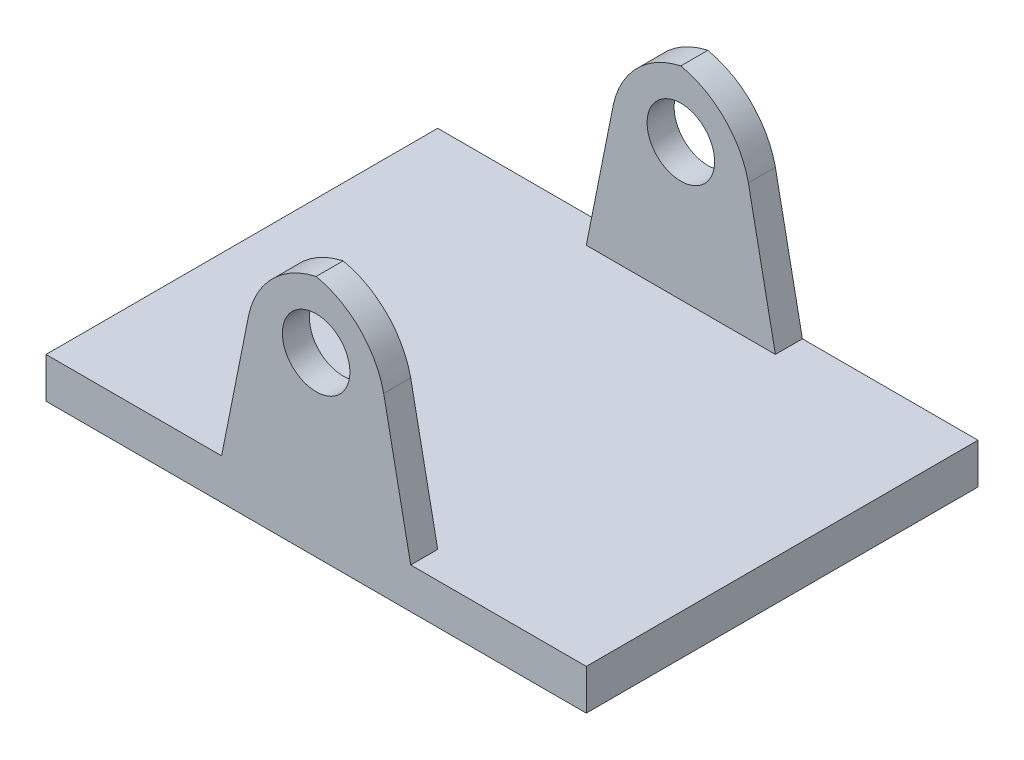
ISO-10303-21;
HEADER;
FILE_DESCRIPTION(('STEP AP214'),'2;1');
FILE_NAME('part.step','',(''),(''),'','','');
FILE_SCHEMA(('AUTOMOTIVE_DESIGN { 1 0 10303 214 1 1 1 1 }'));
ENDSEC;
DATA;
#1=APPLICATION_CONTEXT('core data for automotive mechanical design processes');
#2=APPLICATION_PROTOCOL_DEFINITION('international standard','automotive_design',2000,#1);
#3=PRODUCT_CONTEXT('',#1,'mechanical');
#4=PRODUCT('Part','Part','',(#3));
#5=PRODUCT_RELATED_PRODUCT_CATEGORY('part','',(#4));
#6=PRODUCT_DEFINITION_FORMATION('','',#4);
#7=PRODUCT_DEFINITION_CONTEXT('part definition',#1,'design');
#8=PRODUCT_DEFINITION('design','',#6,#7);
#9=PRODUCT_DEFINITION_SHAPE('','',#8);
#10=(LENGTH_UNIT() NAMED_UNIT(*) SI_UNIT(.MILLI.,.METRE.));
#11=(NAMED_UNIT(*) PLANE_ANGLE_UNIT() SI_UNIT($,.RADIAN.));
#12=(NAMED_UNIT(*) SI_UNIT($,.STERADIAN.) SOLID_ANGLE_UNIT());
#13=UNCERTAINTY_MEASURE_WITH_UNIT(LENGTH_MEASURE(1.E-05),#10,'distance_accuracy_value','');
#14=(GEOMETRIC_REPRESENTATION_CONTEXT(3) GLOBAL_UNCERTAINTY_ASSIGNED_CONTEXT((#13)) GLOBAL_UNIT_ASSIGNED_CONTEXT((#10,
#11,#12)) REPRESENTATION_CONTEXT('',''));
#15=CARTESIAN_POINT('',(0.,0.,0.));
#16=DIRECTION('',(0.,0.,1.));
#17=DIRECTION('',(1.,0.,0.));
#18=AXIS2_PLACEMENT_3D('',#15,#16,#17);
#19=CARTESIAN_POINT('',(-200.,15.,290.));
#20=DIRECTION('',(0.,-1.,0.));
#21=DIRECTION('',(0.,0.,-1.));
#22=AXIS2_PLACEMENT_3D('',#19,#20,#21);
#23=PLANE('',#22);
#24=DIRECTION('',(-1.,0.,0.));
#25=VECTOR('',#24,1.);
#26=CARTESIAN_POINT('',(-200.,15.,0.));
#27=LINE('',#26,#25);
#28=CARTESIAN_POINT('',(200.,15.,0.));
#29=VERTEX_POINT('',#28);
#30=CARTESIAN_POINT('',(70.,15.,0.));
#31=VERTEX_POINT('',#30);
#32=EDGE_CURVE('E239',#29,#31,#27,.T.);
#33=ORIENTED_EDGE('',*,*,#32,.T.);
#34=DIRECTION('',(0.,0.,-1.));
#35=VECTOR('',#34,1.);
#36=CARTESIAN_POINT('',(70.,15.,20.));
#37=LINE('',#36,#35);
#38=CARTESIAN_POINT('',(70.,15.,20.));
#39=VERTEX_POINT('',#38);
#40=EDGE_CURVE('E55',#39,#31,#37,.T.);
#41=ORIENTED_EDGE('',*,*,#40,.F.);
#42=DIRECTION('',(-1.,0.,0.));
#43=VECTOR('',#42,1.);
#44=CARTESIAN_POINT('',(70.,15.,20.));
#45=LINE('',#44,#43);
#46=CARTESIAN_POINT('',(-70.,15.,20.));
#47=VERTEX_POINT('',#46);
#48=EDGE_CURVE('E50',#39,#47,#45,.T.);
#49=ORIENTED_EDGE('',*,*,#48,.T.);
#50=DIRECTION('',(0.,0.,-1.));
#51=VECTOR('',#50,1.);
#52=CARTESIAN_POINT('',(-70.,15.,20.));
#53=LINE('',#52,#51);
#54=CARTESIAN_POINT('',(-70.,15.,0.));
#55=VERTEX_POINT('',#54);
#56=EDGE_CURVE('E146',#47,#55,#53,.T.);
#57=ORIENTED_EDGE('',*,*,#56,.T.);
#58=CARTESIAN_POINT('',(-200.,15.,0.));
#59=VERTEX_POINT('',#58);
#60=EDGE_CURVE('E238',#55,#59,#27,.T.);
#61=ORIENTED_EDGE('',*,*,#60,.T.);
#62=DIRECTION('',(0.,0.,-1.));
#63=VECTOR('',#62,1.);
#64=CARTESIAN_POINT('',(-200.,15.,290.));
#65=LINE('',#64,#63);
#66=CARTESIAN_POINT('',(-200.,15.,290.));
#67=VERTEX_POINT('',#66);
#68=EDGE_CURVE('E43',#67,#59,#65,.T.);
#69=ORIENTED_EDGE('',*,*,#68,.F.);
#70=DIRECTION('',(-1.,0.,0.));
#71=VECTOR('',#70,1.);
#72=CARTESIAN_POINT('',(-200.,15.,290.));
#73=LINE('',#72,#71);
#74=CARTESIAN_POINT('',(-70.,15.,290.));
#75=VERTEX_POINT('',#74);
#76=EDGE_CURVE('E226',#75,#67,#73,.T.);
#77=ORIENTED_EDGE('',*,*,#76,.F.);
#78=DIRECTION('',(0.,0.,1.));
#79=VECTOR('',#78,1.);
#80=CARTESIAN_POINT('',(-70.,15.,270.));
#81=LINE('',#80,#79);
#82=CARTESIAN_POINT('',(-70.,15.,270.));
#83=VERTEX_POINT('',#82);
#84=EDGE_CURVE('E219',#83,#75,#81,.T.);
#85=ORIENTED_EDGE('',*,*,#84,.F.);
#86=DIRECTION('',(-1.,0.,0.));
#87=VECTOR('',#86,1.);
#88=CARTESIAN_POINT('',(0.,15.,270.));
#89=LINE('',#88,#87);
#90=CARTESIAN_POINT('',(70.,15.,270.));
#91=VERTEX_POINT('',#90);
#92=EDGE_CURVE('E193',#91,#83,#89,.T.);
#93=ORIENTED_EDGE('',*,*,#92,.F.);
#94=DIRECTION('',(0.,0.,1.));
#95=VECTOR('',#94,1.);
#96=CARTESIAN_POINT('',(70.,15.,270.));
#97=LINE('',#96,#95);
#98=CARTESIAN_POINT('',(70.,15.,290.));
#99=VERTEX_POINT('',#98);
#100=EDGE_CURVE('E216',#91,#99,#97,.T.);
#101=ORIENTED_EDGE('',*,*,#100,.T.);
#102=CARTESIAN_POINT('',(200.,15.,290.));
#103=VERTEX_POINT('',#102);
#104=EDGE_CURVE('E228',#103,#99,#73,.T.);
#105=ORIENTED_EDGE('',*,*,#104,.F.);
#106=DIRECTION('',(0.,0.,-1.));
#107=VECTOR('',#106,1.);
#108=CARTESIAN_POINT('',(200.,15.,290.));
#109=LINE('',#108,#107);
#110=EDGE_CURVE('E11',#103,#29,#109,.T.);
#111=ORIENTED_EDGE('',*,*,#110,.T.);
#112=EDGE_LOOP('',(#33,#41,#49,#57,#61,#69,#77,#85,#93,#101,#105,#111));
#113=FACE_BOUND('',#112,.T.);
#114=ADVANCED_FACE('F35',(#113),#23,.F.);
#115=CARTESIAN_POINT('',(200.,-15.,290.));
#116=DIRECTION('',(-1.,0.,0.));
#117=DIRECTION('',(0.,0.,1.));
#118=AXIS2_PLACEMENT_3D('',#115,#116,#117);
#119=PLANE('',#118);
#120=DIRECTION('',(0.,1.,0.));
#121=VECTOR('',#120,1.);
#122=CARTESIAN_POINT('',(200.,-15.,0.));
#123=LINE('',#122,#121);
#124=CARTESIAN_POINT('',(200.,-15.,0.));
#125=VERTEX_POINT('',#124);
#126=EDGE_CURVE('E213',#125,#29,#123,.T.);
#127=ORIENTED_EDGE('',*,*,#126,.T.);
#128=ORIENTED_EDGE('',*,*,#110,.F.);
#129=DIRECTION('',(0.,1.,0.));
#130=VECTOR('',#129,1.);
#131=CARTESIAN_POINT('',(200.,-15.,290.));
#132=LINE('',#131,#130);
#133=CARTESIAN_POINT('',(200.,-15.,290.));
#134=VERTEX_POINT('',#133);
#135=EDGE_CURVE('E223',#134,#103,#132,.T.);
#136=ORIENTED_EDGE('',*,*,#135,.F.);
#137=DIRECTION('',(0.,0.,-1.));
#138=VECTOR('',#137,1.);
#139=CARTESIAN_POINT('',(200.,-15.,290.));
#140=LINE('',#139,#138);
#141=EDGE_CURVE('E235',#134,#125,#140,.T.);
#142=ORIENTED_EDGE('',*,*,#141,.T.);
#143=EDGE_LOOP('',(#127,#128,#136,#142));
#144=FACE_BOUND('',#143,.T.);
#145=ADVANCED_FACE('F37',(#144),#119,.F.);
#146=CARTESIAN_POINT('',(-200.,-15.,290.));
#147=DIRECTION('',(1.,0.,0.));
#148=DIRECTION('',(0.,0.,-1.));
#149=AXIS2_PLACEMENT_3D('',#146,#147,#148);
#150=PLANE('',#149);
#151=DIRECTION('',(0.,-1.,0.));
#152=VECTOR('',#151,1.);
#153=CARTESIAN_POINT('',(-200.,-15.,0.));
#154=LINE('',#153,#152);
#155=CARTESIAN_POINT('',(-200.,-15.,0.));
#156=VERTEX_POINT('',#155);
#157=EDGE_CURVE('E241',#59,#156,#154,.T.);
#158=ORIENTED_EDGE('',*,*,#157,.T.);
#159=DIRECTION('',(0.,0.,-1.));
#160=VECTOR('',#159,1.);
#161=CARTESIAN_POINT('',(-200.,-15.,290.));
#162=LINE('',#161,#160);
#163=CARTESIAN_POINT('',(-200.,-15.,290.));
#164=VERTEX_POINT('',#163);
#165=EDGE_CURVE('E246',#164,#156,#162,.T.);
#166=ORIENTED_EDGE('',*,*,#165,.F.);
#167=DIRECTION('',(0.,-1.,0.));
#168=VECTOR('',#167,1.);
#169=CARTESIAN_POINT('',(-200.,-15.,290.));
#170=LINE('',#169,#168);
#171=EDGE_CURVE('E231',#67,#164,#170,.T.);
#172=ORIENTED_EDGE('',*,*,#171,.F.);
#173=ORIENTED_EDGE('',*,*,#68,.T.);
#174=EDGE_LOOP('',(#158,#166,#172,#173));
#175=FACE_BOUND('',#174,.T.);
#176=ADVANCED_FACE('F253',(#175),#150,.F.);
#177=CARTESIAN_POINT('',(-200.,-15.,290.));
#178=DIRECTION('',(0.,1.,0.));
#179=DIRECTION('',(0.,0.,1.));
#180=AXIS2_PLACEMENT_3D('',#177,#178,#179);
#181=PLANE('',#180);
#182=DIRECTION('',(1.,0.,0.));
#183=VECTOR('',#182,1.);
#184=CARTESIAN_POINT('',(-200.,-15.,0.));
#185=LINE('',#184,#183);
#186=EDGE_CURVE('E227',#156,#125,#185,.T.);
#187=ORIENTED_EDGE('',*,*,#186,.T.);
#188=ORIENTED_EDGE('',*,*,#141,.F.);
#189=DIRECTION('',(1.,0.,0.));
#190=VECTOR('',#189,1.);
#191=CARTESIAN_POINT('',(-200.,-15.,290.));
#192=LINE('',#191,#190);
#193=EDGE_CURVE('E233',#164,#134,#192,.T.);
#194=ORIENTED_EDGE('',*,*,#193,.F.);
#195=ORIENTED_EDGE('',*,*,#165,.T.);
#196=EDGE_LOOP('',(#187,#188,#194,#195));
#197=FACE_BOUND('',#196,.T.);
#198=ADVANCED_FACE('F263',(#197),#181,.F.);
#199=CARTESIAN_POINT('',(0.,0.,290.));
#200=DIRECTION('',(0.,0.,-1.));
#201=DIRECTION('',(-1.,0.,0.));
#202=AXIS2_PLACEMENT_3D('',#199,#200,#201);
#203=PLANE('',#202);
#204=CARTESIAN_POINT('',(0.,116.092070286544,290.));
#205=DIRECTION('',(0.,0.,1.));
#206=DIRECTION('',(1.,0.,0.));
#207=AXIS2_PLACEMENT_3D('',#204,#205,#206);
#208=CIRCLE('',#207,25.);
#209=CARTESIAN_POINT('',(25.,116.092070286544,290.));
#210=VERTEX_POINT('',#209);
#211=EDGE_CURVE('E177',#210,#210,#208,.T.);
#212=ORIENTED_EDGE('',*,*,#211,.F.);
#213=EDGE_LOOP('',(#212));
#214=FACE_BOUND('',#213,.T.);
#215=ORIENTED_EDGE('',*,*,#135,.T.);
#216=ORIENTED_EDGE('',*,*,#104,.T.);
#217=DIRECTION('',(-0.196116135138184,0.98058067569092,0.));
#218=VECTOR('',#217,1.);
#219=CARTESIAN_POINT('',(70.1923076923077,14.0384615384615,290.));
#220=LINE('',#219,#218);
#221=CARTESIAN_POINT('',(50.,115.,290.));
#222=VERTEX_POINT('',#221);
#223=EDGE_CURVE('E206',#99,#222,#220,.T.);
#224=ORIENTED_EDGE('',*,*,#223,.T.);
#225=CARTESIAN_POINT('',(-13.775252036124,101.224747963876,290.));
#226=DIRECTION('',(0.,0.,1.));
#227=DIRECTION('',(1.,0.,0.));
#228=AXIS2_PLACEMENT_3D('',#225,#226,#227);
#229=CIRCLE('',#228,65.2459986583842);
#230=CARTESIAN_POINT('',(0.,165.,290.));
#231=VERTEX_POINT('',#230);
#232=EDGE_CURVE('E191',#222,#231,#229,.T.);
#233=ORIENTED_EDGE('',*,*,#232,.T.);
#234=CARTESIAN_POINT('',(13.775252036124,101.224747963876,290.));
#235=DIRECTION('',(0.,0.,1.));
#236=DIRECTION('',(1.,0.,0.));
#237=AXIS2_PLACEMENT_3D('',#234,#235,#236);
#238=CIRCLE('',#237,65.2459986583842);
#239=CARTESIAN_POINT('',(-50.,115.,290.));
#240=VERTEX_POINT('',#239);
#241=EDGE_CURVE('E185',#240,#231,#238,.F.);
#242=ORIENTED_EDGE('',*,*,#241,.F.);
#243=DIRECTION('',(0.196116135138184,0.98058067569092,0.));
#244=VECTOR('',#243,1.);
#245=CARTESIAN_POINT('',(-70.1923076923077,14.0384615384615,290.));
#246=LINE('',#245,#244);
#247=EDGE_CURVE('E204',#75,#240,#246,.T.);
#248=ORIENTED_EDGE('',*,*,#247,.F.);
#249=ORIENTED_EDGE('',*,*,#76,.T.);
#250=ORIENTED_EDGE('',*,*,#171,.T.);
#251=ORIENTED_EDGE('',*,*,#193,.T.);
#252=EDGE_LOOP('',(#215,#216,#224,#233,#242,#248,#249,#250,#251));
#253=FACE_BOUND('',#252,.T.);
#254=ADVANCED_FACE('F269',(#214,#253),#203,.F.);
#255=CARTESIAN_POINT('',(0.,0.,0.));
#256=DIRECTION('',(0.,0.,-1.));
#257=DIRECTION('',(-1.,0.,0.));
#258=AXIS2_PLACEMENT_3D('',#255,#256,#257);
#259=PLANE('',#258);
#260=ORIENTED_EDGE('',*,*,#126,.F.);
#261=ORIENTED_EDGE('',*,*,#186,.F.);
#262=ORIENTED_EDGE('',*,*,#157,.F.);
#263=ORIENTED_EDGE('',*,*,#60,.F.);
#264=DIRECTION('',(0.196116135138184,0.98058067569092,0.));
#265=VECTOR('',#264,1.);
#266=CARTESIAN_POINT('',(-70.,15.,0.));
#267=LINE('',#266,#265);
#268=CARTESIAN_POINT('',(-50.,115.,0.));
#269=VERTEX_POINT('',#268);
#270=EDGE_CURVE('E167',#55,#269,#267,.T.);
#271=ORIENTED_EDGE('',*,*,#270,.T.);
#272=CARTESIAN_POINT('',(13.7752520361242,101.224747963876,0.));
#273=DIRECTION('',(0.,0.,-1.));
#274=DIRECTION('',(1.,0.,0.));
#275=AXIS2_PLACEMENT_3D('',#272,#273,#274);
#276=CIRCLE('',#275,65.2459986583845);
#277=CARTESIAN_POINT('',(0.,165.,0.));
#278=VERTEX_POINT('',#277);
#279=EDGE_CURVE('E140',#269,#278,#276,.T.);
#280=ORIENTED_EDGE('',*,*,#279,.T.);
#281=CARTESIAN_POINT('',(-13.775252036124,101.224747963876,0.));
#282=DIRECTION('',(0.,0.,-1.));
#283=DIRECTION('',(1.,0.,0.));
#284=AXIS2_PLACEMENT_3D('',#281,#282,#283);
#285=CIRCLE('',#284,65.2459986583843);
#286=CARTESIAN_POINT('',(50.,115.,0.));
#287=VERTEX_POINT('',#286);
#288=EDGE_CURVE('E171',#278,#287,#285,.T.);
#289=ORIENTED_EDGE('',*,*,#288,.T.);
#290=DIRECTION('',(0.196116135138184,-0.98058067569092,0.));
#291=VECTOR('',#290,1.);
#292=CARTESIAN_POINT('',(70.,15.,0.));
#293=LINE('',#292,#291);
#294=EDGE_CURVE('E159',#287,#31,#293,.T.);
#295=ORIENTED_EDGE('',*,*,#294,.T.);
#296=ORIENTED_EDGE('',*,*,#32,.F.);
#297=EDGE_LOOP('',(#260,#261,#262,#263,#271,#280,#289,#295,#296));
#298=FACE_BOUND('',#297,.T.);
#299=CARTESIAN_POINT('',(0.,116.092070286544,0.));
#300=DIRECTION('',(0.,0.,-1.));
#301=DIRECTION('',(-1.,0.,0.));
#302=AXIS2_PLACEMENT_3D('',#299,#300,#301);
#303=CIRCLE('',#302,25.);
#304=CARTESIAN_POINT('',(-25.,116.092070286544,0.));
#305=VERTEX_POINT('',#304);
#306=EDGE_CURVE('E347',#305,#305,#303,.T.);
#307=ORIENTED_EDGE('',*,*,#306,.F.);
#308=EDGE_LOOP('',(#307));
#309=FACE_BOUND('',#308,.T.);
#310=ADVANCED_FACE('F259',(#298,#309),#259,.T.);
#311=CARTESIAN_POINT('',(13.775252036124,101.224747963876,270.));
#312=DIRECTION('',(0.,0.,1.));
#313=DIRECTION('',(1.,0.,0.));
#314=AXIS2_PLACEMENT_3D('',#311,#312,#313);
#315=CYLINDRICAL_SURFACE('',#314,65.2459986583842);
#316=ORIENTED_EDGE('',*,*,#241,.T.);
#317=DIRECTION('',(0.,0.,1.));
#318=VECTOR('',#317,1.);
#319=CARTESIAN_POINT('',(0.,165.,270.));
#320=LINE('',#319,#318);
#321=CARTESIAN_POINT('',(0.,165.,270.));
#322=VERTEX_POINT('',#321);
#323=EDGE_CURVE('E211',#322,#231,#320,.T.);
#324=ORIENTED_EDGE('',*,*,#323,.F.);
#325=CARTESIAN_POINT('',(13.775252036124,101.224747963876,270.));
#326=DIRECTION('',(0.,0.,1.));
#327=DIRECTION('',(1.,0.,0.));
#328=AXIS2_PLACEMENT_3D('',#325,#326,#327);
#329=CIRCLE('',#328,65.2459986583842);
#330=CARTESIAN_POINT('',(-50.,115.,270.));
#331=VERTEX_POINT('',#330);
#332=EDGE_CURVE('E188',#331,#322,#329,.F.);
#333=ORIENTED_EDGE('',*,*,#332,.F.);
#334=DIRECTION('',(0.,0.,1.));
#335=VECTOR('',#334,1.);
#336=CARTESIAN_POINT('',(-50.,115.,270.));
#337=LINE('',#336,#335);
#338=EDGE_CURVE('E201',#331,#240,#337,.T.);
#339=ORIENTED_EDGE('',*,*,#338,.T.);
#340=EDGE_LOOP('',(#316,#324,#333,#339));
#341=FACE_BOUND('',#340,.T.);
#342=ADVANCED_FACE('F312',(#341),#315,.T.);
#343=CARTESIAN_POINT('',(-13.775252036124,101.224747963876,270.));
#344=DIRECTION('',(0.,0.,1.));
#345=DIRECTION('',(1.,0.,0.));
#346=AXIS2_PLACEMENT_3D('',#343,#344,#345);
#347=CYLINDRICAL_SURFACE('',#346,65.2459986583842);
#348=ORIENTED_EDGE('',*,*,#232,.F.);
#349=DIRECTION('',(0.,0.,1.));
#350=VECTOR('',#349,1.);
#351=CARTESIAN_POINT('',(50.,115.,270.));
#352=LINE('',#351,#350);
#353=CARTESIAN_POINT('',(50.,115.,270.));
#354=VERTEX_POINT('',#353);
#355=EDGE_CURVE('E214',#354,#222,#352,.T.);
#356=ORIENTED_EDGE('',*,*,#355,.F.);
#357=CARTESIAN_POINT('',(-13.775252036124,101.224747963876,270.));
#358=DIRECTION('',(0.,0.,1.));
#359=DIRECTION('',(1.,0.,0.));
#360=AXIS2_PLACEMENT_3D('',#357,#358,#359);
#361=CIRCLE('',#360,65.2459986583842);
#362=EDGE_CURVE('E198',#354,#322,#361,.T.);
#363=ORIENTED_EDGE('',*,*,#362,.T.);
#364=ORIENTED_EDGE('',*,*,#323,.T.);
#365=EDGE_LOOP('',(#348,#356,#363,#364));
#366=FACE_BOUND('',#365,.T.);
#367=ADVANCED_FACE('F318',(#366),#347,.T.);
#368=CARTESIAN_POINT('',(70.1923076923077,14.0384615384615,270.));
#369=DIRECTION('',(0.98058067569092,0.196116135138184,0.));
#370=DIRECTION('',(-0.196116135138184,0.98058067569092,0.));
#371=AXIS2_PLACEMENT_3D('',#368,#369,#370);
#372=PLANE('',#371);
#373=ORIENTED_EDGE('',*,*,#223,.F.);
#374=ORIENTED_EDGE('',*,*,#100,.F.);
#375=DIRECTION('',(-0.196116135138184,0.98058067569092,0.));
#376=VECTOR('',#375,1.);
#377=CARTESIAN_POINT('',(70.1923076923077,14.0384615384615,270.));
#378=LINE('',#377,#376);
#379=EDGE_CURVE('E195',#91,#354,#378,.T.);
#380=ORIENTED_EDGE('',*,*,#379,.T.);
#381=ORIENTED_EDGE('',*,*,#355,.T.);
#382=EDGE_LOOP('',(#373,#374,#380,#381));
#383=FACE_BOUND('',#382,.T.);
#384=ADVANCED_FACE('F285',(#383),#372,.T.);
#385=CARTESIAN_POINT('',(-70.1923076923077,14.0384615384615,270.));
#386=DIRECTION('',(0.98058067569092,-0.196116135138184,0.));
#387=DIRECTION('',(0.196116135138184,0.98058067569092,0.));
#388=AXIS2_PLACEMENT_3D('',#385,#386,#387);
#389=PLANE('',#388);
#390=ORIENTED_EDGE('',*,*,#247,.T.);
#391=ORIENTED_EDGE('',*,*,#338,.F.);
#392=DIRECTION('',(0.196116135138184,0.98058067569092,0.));
#393=VECTOR('',#392,1.);
#394=CARTESIAN_POINT('',(-70.1923076923077,14.0384615384615,270.));
#395=LINE('',#394,#393);
#396=EDGE_CURVE('E190',#83,#331,#395,.T.);
#397=ORIENTED_EDGE('',*,*,#396,.F.);
#398=ORIENTED_EDGE('',*,*,#84,.T.);
#399=EDGE_LOOP('',(#390,#391,#397,#398));
#400=FACE_BOUND('',#399,.T.);
#401=ADVANCED_FACE('F276',(#400),#389,.F.);
#402=CARTESIAN_POINT('',(0.,0.,270.));
#403=DIRECTION('',(0.,0.,1.));
#404=DIRECTION('',(1.,0.,0.));
#405=AXIS2_PLACEMENT_3D('',#402,#403,#404);
#406=PLANE('',#405);
#407=CARTESIAN_POINT('',(0.,116.092070286544,270.));
#408=DIRECTION('',(0.,0.,1.));
#409=DIRECTION('',(1.,0.,0.));
#410=AXIS2_PLACEMENT_3D('',#407,#408,#409);
#411=CIRCLE('',#410,25.);
#412=CARTESIAN_POINT('',(25.,116.092070286544,270.));
#413=VERTEX_POINT('',#412);
#414=EDGE_CURVE('E182',#413,#413,#411,.T.);
#415=ORIENTED_EDGE('',*,*,#414,.T.);
#416=EDGE_LOOP('',(#415));
#417=FACE_BOUND('',#416,.T.);
#418=ORIENTED_EDGE('',*,*,#332,.T.);
#419=ORIENTED_EDGE('',*,*,#362,.F.);
#420=ORIENTED_EDGE('',*,*,#379,.F.);
#421=ORIENTED_EDGE('',*,*,#92,.T.);
#422=ORIENTED_EDGE('',*,*,#396,.T.);
#423=EDGE_LOOP('',(#418,#419,#420,#421,#422));
#424=FACE_BOUND('',#423,.T.);
#425=ADVANCED_FACE('F280',(#417,#424),#406,.F.);
#426=CARTESIAN_POINT('',(0.,116.092070286544,270.));
#427=DIRECTION('',(0.,0.,1.));
#428=DIRECTION('',(1.,0.,0.));
#429=AXIS2_PLACEMENT_3D('',#426,#427,#428);
#430=CYLINDRICAL_SURFACE('',#429,25.);
#431=ORIENTED_EDGE('',*,*,#414,.F.);
#432=EDGE_LOOP('',(#431));
#433=FACE_BOUND('',#432,.T.);
#434=ORIENTED_EDGE('',*,*,#211,.T.);
#435=EDGE_LOOP('',(#434));
#436=FACE_BOUND('',#435,.T.);
#437=ADVANCED_FACE('F299',(#433,#436),#430,.F.);
#438=CARTESIAN_POINT('',(70.,15.,20.));
#439=DIRECTION('',(0.98058067569092,0.196116135138184,0.));
#440=DIRECTION('',(-0.196116135138184,0.98058067569092,0.));
#441=AXIS2_PLACEMENT_3D('',#438,#439,#440);
#442=PLANE('',#441);
#443=ORIENTED_EDGE('',*,*,#294,.F.);
#444=DIRECTION('',(0.,0.,-1.));
#445=VECTOR('',#444,1.);
#446=CARTESIAN_POINT('',(50.,115.,20.));
#447=LINE('',#446,#445);
#448=CARTESIAN_POINT('',(50.,115.,20.));
#449=VERTEX_POINT('',#448);
#450=EDGE_CURVE('E178',#449,#287,#447,.T.);
#451=ORIENTED_EDGE('',*,*,#450,.F.);
#452=DIRECTION('',(0.196116135138184,-0.98058067569092,0.));
#453=VECTOR('',#452,1.);
#454=CARTESIAN_POINT('',(70.,15.,20.));
#455=LINE('',#454,#453);
#456=EDGE_CURVE('E164',#449,#39,#455,.T.);
#457=ORIENTED_EDGE('',*,*,#456,.T.);
#458=ORIENTED_EDGE('',*,*,#40,.T.);
#459=EDGE_LOOP('',(#443,#451,#457,#458));
#460=FACE_BOUND('',#459,.T.);
#461=ADVANCED_FACE('F288',(#460),#442,.T.);
#462=CARTESIAN_POINT('',(-13.775252036124,101.224747963876,20.));
#463=DIRECTION('',(0.,0.,-1.));
#464=DIRECTION('',(-1.,0.,0.));
#465=AXIS2_PLACEMENT_3D('',#462,#463,#464);
#466=CYLINDRICAL_SURFACE('',#465,65.2459986583843);
#467=ORIENTED_EDGE('',*,*,#288,.F.);
#468=DIRECTION('',(0.,0.,-1.));
#469=VECTOR('',#468,1.);
#470=CARTESIAN_POINT('',(0.,165.,20.));
#471=LINE('',#470,#469);
#472=CARTESIAN_POINT('',(0.,165.,20.));
#473=VERTEX_POINT('',#472);
#474=EDGE_CURVE('E145',#473,#278,#471,.T.);
#475=ORIENTED_EDGE('',*,*,#474,.F.);
#476=CARTESIAN_POINT('',(-13.775252036124,101.224747963876,20.));
#477=DIRECTION('',(0.,0.,-1.));
#478=DIRECTION('',(1.,0.,0.));
#479=AXIS2_PLACEMENT_3D('',#476,#477,#478);
#480=CIRCLE('',#479,65.2459986583843);
#481=EDGE_CURVE('E155',#473,#449,#480,.T.);
#482=ORIENTED_EDGE('',*,*,#481,.T.);
#483=ORIENTED_EDGE('',*,*,#450,.T.);
#484=EDGE_LOOP('',(#467,#475,#482,#483));
#485=FACE_BOUND('',#484,.T.);
#486=ADVANCED_FACE('F291',(#485),#466,.T.);
#487=CARTESIAN_POINT('',(13.7752520361242,101.224747963876,20.));
#488=DIRECTION('',(0.,0.,-1.));
#489=DIRECTION('',(-1.,0.,0.));
#490=AXIS2_PLACEMENT_3D('',#487,#488,#489);
#491=CYLINDRICAL_SURFACE('',#490,65.2459986583845);
#492=ORIENTED_EDGE('',*,*,#279,.F.);
#493=DIRECTION('',(0.,0.,-1.));
#494=VECTOR('',#493,1.);
#495=CARTESIAN_POINT('',(-50.,115.,20.));
#496=LINE('',#495,#494);
#497=CARTESIAN_POINT('',(-50.,115.,20.));
#498=VERTEX_POINT('',#497);
#499=EDGE_CURVE('E135',#498,#269,#496,.T.);
#500=ORIENTED_EDGE('',*,*,#499,.F.);
#501=CARTESIAN_POINT('',(13.7752520361242,101.224747963876,20.));
#502=DIRECTION('',(0.,0.,-1.));
#503=DIRECTION('',(1.,0.,0.));
#504=AXIS2_PLACEMENT_3D('',#501,#502,#503);
#505=CIRCLE('',#504,65.2459986583845);
#506=EDGE_CURVE('E138',#498,#473,#505,.T.);
#507=ORIENTED_EDGE('',*,*,#506,.T.);
#508=ORIENTED_EDGE('',*,*,#474,.T.);
#509=EDGE_LOOP('',(#492,#500,#507,#508));
#510=FACE_BOUND('',#509,.T.);
#511=ADVANCED_FACE('F137',(#510),#491,.T.);
#512=CARTESIAN_POINT('',(-70.,15.,20.));
#513=DIRECTION('',(-0.98058067569092,0.196116135138184,0.));
#514=DIRECTION('',(-0.196116135138184,-0.98058067569092,0.));
#515=AXIS2_PLACEMENT_3D('',#512,#513,#514);
#516=PLANE('',#515);
#517=ORIENTED_EDGE('',*,*,#270,.F.);
#518=ORIENTED_EDGE('',*,*,#56,.F.);
#519=DIRECTION('',(0.196116135138184,0.98058067569092,0.));
#520=VECTOR('',#519,1.);
#521=CARTESIAN_POINT('',(-70.,15.,20.));
#522=LINE('',#521,#520);
#523=EDGE_CURVE('E152',#47,#498,#522,.T.);
#524=ORIENTED_EDGE('',*,*,#523,.T.);
#525=ORIENTED_EDGE('',*,*,#499,.T.);
#526=EDGE_LOOP('',(#517,#518,#524,#525));
#527=FACE_BOUND('',#526,.T.);
#528=ADVANCED_FACE('F157',(#527),#516,.T.);
#529=CARTESIAN_POINT('',(13.7752520361242,101.224747963876,20.));
#530=DIRECTION('',(0.,0.,1.));
#531=DIRECTION('',(1.,0.,0.));
#532=AXIS2_PLACEMENT_3D('',#529,#530,#531);
#533=PLANE('',#532);
#534=CARTESIAN_POINT('',(0.,116.092070286544,20.));
#535=DIRECTION('',(0.,0.,-1.));
#536=DIRECTION('',(-1.,0.,0.));
#537=AXIS2_PLACEMENT_3D('',#534,#535,#536);
#538=CIRCLE('',#537,25.);
#539=CARTESIAN_POINT('',(-25.,116.092070286544,20.));
#540=VERTEX_POINT('',#539);
#541=EDGE_CURVE('E169',#540,#540,#538,.T.);
#542=ORIENTED_EDGE('',*,*,#541,.T.);
#543=EDGE_LOOP('',(#542));
#544=FACE_BOUND('',#543,.T.);
#545=ORIENTED_EDGE('',*,*,#48,.F.);
#546=ORIENTED_EDGE('',*,*,#456,.F.);
#547=ORIENTED_EDGE('',*,*,#481,.F.);
#548=ORIENTED_EDGE('',*,*,#506,.F.);
#549=ORIENTED_EDGE('',*,*,#523,.F.);
#550=EDGE_LOOP('',(#545,#546,#547,#548,#549));
#551=FACE_BOUND('',#550,.T.);
#552=ADVANCED_FACE('F151',(#544,#551),#533,.T.);
#553=CARTESIAN_POINT('',(0.,116.092070286544,20.));
#554=DIRECTION('',(0.,0.,-1.));
#555=DIRECTION('',(-1.,0.,0.));
#556=AXIS2_PLACEMENT_3D('',#553,#554,#555);
#557=CYLINDRICAL_SURFACE('',#556,25.);
#558=ORIENTED_EDGE('',*,*,#541,.F.);
#559=EDGE_LOOP('',(#558));
#560=FACE_BOUND('',#559,.T.);
#561=ORIENTED_EDGE('',*,*,#306,.T.);
#562=EDGE_LOOP('',(#561));
#563=FACE_BOUND('',#562,.T.);
#564=ADVANCED_FACE('F337',(#560,#563),#557,.F.);
#565=CLOSED_SHELL('',(#114,#145,#176,#198,#254,#310,#342,#367,#384,#401,#425,#437,#461,#486,
#511,#528,#552,#564));
#566=MANIFOLD_SOLID_BREP('B2',#565);
#567=ADVANCED_BREP_SHAPE_REPRESENTATION('',(#18,#566),#14);
#568=SHAPE_DEFINITION_REPRESENTATION(#9,#567);
ENDSEC;
END-ISO-10303-21;
